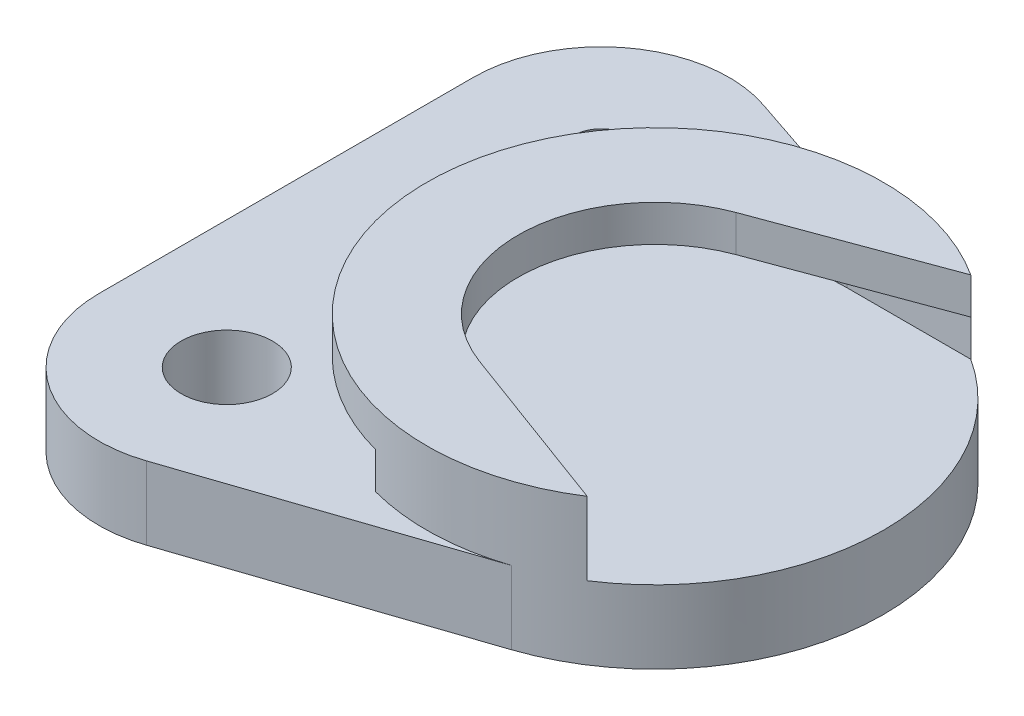
ISO-10303-21;
HEADER;
FILE_DESCRIPTION(('STEP AP214'),'2;1');
FILE_NAME('part.step','',(''),(''),'','','');
FILE_SCHEMA(('AUTOMOTIVE_DESIGN { 1 0 10303 214 1 1 1 1 }'));
ENDSEC;
DATA;
#1=APPLICATION_CONTEXT('core data for automotive mechanical design processes');
#2=APPLICATION_PROTOCOL_DEFINITION('international standard','automotive_design',2000,#1);
#3=PRODUCT_CONTEXT('',#1,'mechanical');
#4=PRODUCT('Part','Part','',(#3));
#5=PRODUCT_RELATED_PRODUCT_CATEGORY('part','',(#4));
#6=PRODUCT_DEFINITION_FORMATION('','',#4);
#7=PRODUCT_DEFINITION_CONTEXT('part definition',#1,'design');
#8=PRODUCT_DEFINITION('design','',#6,#7);
#9=PRODUCT_DEFINITION_SHAPE('','',#8);
#10=(LENGTH_UNIT() NAMED_UNIT(*) SI_UNIT(.MILLI.,.METRE.));
#11=(NAMED_UNIT(*) PLANE_ANGLE_UNIT() SI_UNIT($,.RADIAN.));
#12=(NAMED_UNIT(*) SI_UNIT($,.STERADIAN.) SOLID_ANGLE_UNIT());
#13=UNCERTAINTY_MEASURE_WITH_UNIT(LENGTH_MEASURE(1.E-05),#10,'distance_accuracy_value','');
#14=(GEOMETRIC_REPRESENTATION_CONTEXT(3) GLOBAL_UNCERTAINTY_ASSIGNED_CONTEXT((#13)) GLOBAL_UNIT_ASSIGNED_CONTEXT((#10,
#11,#12)) REPRESENTATION_CONTEXT('',''));
#15=CARTESIAN_POINT('',(0.,0.,0.));
#16=DIRECTION('',(0.,0.,1.));
#17=DIRECTION('',(1.,0.,0.));
#18=AXIS2_PLACEMENT_3D('',#15,#16,#17);
#19=CARTESIAN_POINT('',(0.,2.,0.));
#20=DIRECTION('',(0.,1.,0.));
#21=DIRECTION('',(0.,0.,1.));
#22=AXIS2_PLACEMENT_3D('',#19,#20,#21);
#23=PLANE('',#22);
#24=CARTESIAN_POINT('',(0.,2.,0.));
#25=DIRECTION('',(0.,-1.,0.));
#26=DIRECTION('',(0.,0.,-1.));
#27=AXIS2_PLACEMENT_3D('',#24,#25,#26);
#28=CIRCLE('',#27,12.5);
#29=CARTESIAN_POINT('',(3.99026691868763,2.,11.8460022757733));
#30=VERTEX_POINT('',#29);
#31=CARTESIAN_POINT('',(-3.23523806378148,2.,12.0740728286134));
#32=VERTEX_POINT('',#31);
#33=EDGE_CURVE('E57',#30,#32,#28,.T.);
#34=ORIENTED_EDGE('',*,*,#33,.T.);
#35=DIRECTION('',(-0.258819045102518,0.,0.965925826289069));
#36=VECTOR('',#35,1.);
#37=CARTESIAN_POINT('',(0.,2.,0.));
#38=LINE('',#37,#36);
#39=CARTESIAN_POINT('',(-2.71759997357644,2.,10.1422211760352));
#40=VERTEX_POINT('',#39);
#41=EDGE_CURVE('E371',#40,#32,#38,.T.);
#42=ORIENTED_EDGE('',*,*,#41,.F.);
#43=CARTESIAN_POINT('',(0.,2.,0.));
#44=DIRECTION('',(0.,1.,0.));
#45=DIRECTION('',(0.,0.,1.));
#46=AXIS2_PLACEMENT_3D('',#43,#44,#45);
#47=CIRCLE('',#46,10.5);
#48=CARTESIAN_POINT('',(0.,2.,10.5));
#49=VERTEX_POINT('',#48);
#50=EDGE_CURVE('E355',#40,#49,#47,.T.);
#51=ORIENTED_EDGE('',*,*,#50,.T.);
#52=DIRECTION('',(1.,0.,0.));
#53=VECTOR('',#52,1.);
#54=CARTESIAN_POINT('',(0.,2.,10.5));
#55=LINE('',#54,#53);
#56=CARTESIAN_POINT('',(6.78232998312527,2.,10.5));
#57=VERTEX_POINT('',#56);
#58=EDGE_CURVE('E361',#49,#57,#55,.T.);
#59=ORIENTED_EDGE('',*,*,#58,.T.);
#60=CARTESIAN_POINT('',(0.,2.,0.));
#61=DIRECTION('',(0.,1.,0.));
#62=DIRECTION('',(0.,0.,1.));
#63=AXIS2_PLACEMENT_3D('',#60,#61,#62);
#64=CIRCLE('',#63,12.5);
#65=CARTESIAN_POINT('',(6.78232998312527,2.,-10.5));
#66=VERTEX_POINT('',#65);
#67=EDGE_CURVE('E11',#57,#66,#64,.T.);
#68=ORIENTED_EDGE('',*,*,#67,.T.);
#69=DIRECTION('',(1.,0.,0.));
#70=VECTOR('',#69,1.);
#71=CARTESIAN_POINT('',(0.,2.,-10.5));
#72=LINE('',#71,#70);
#73=CARTESIAN_POINT('',(0.,2.,-10.5));
#74=VERTEX_POINT('',#73);
#75=EDGE_CURVE('E333',#74,#66,#72,.T.);
#76=ORIENTED_EDGE('',*,*,#75,.F.);
#77=CARTESIAN_POINT('',(0.,2.,0.));
#78=DIRECTION('',(0.,1.,0.));
#79=DIRECTION('',(0.,0.,1.));
#80=AXIS2_PLACEMENT_3D('',#77,#78,#79);
#81=CIRCLE('',#80,10.5);
#82=CARTESIAN_POINT('',(-2.71759997357644,2.,-10.1422211760352));
#83=VERTEX_POINT('',#82);
#84=EDGE_CURVE('E317',#74,#83,#81,.T.);
#85=ORIENTED_EDGE('',*,*,#84,.T.);
#86=DIRECTION('',(-0.258819045102518,0.,-0.965925826289069));
#87=VECTOR('',#86,1.);
#88=CARTESIAN_POINT('',(0.,2.,0.));
#89=LINE('',#88,#87);
#90=CARTESIAN_POINT('',(-3.23523806378147,2.,-12.0740728286134));
#91=VERTEX_POINT('',#90);
#92=EDGE_CURVE('E323',#83,#91,#89,.T.);
#93=ORIENTED_EDGE('',*,*,#92,.T.);
#94=CARTESIAN_POINT('',(3.99026691868763,2.,-11.8460022757733));
#95=VERTEX_POINT('',#94);
#96=EDGE_CURVE('E256',#91,#95,#28,.T.);
#97=ORIENTED_EDGE('',*,*,#96,.T.);
#98=DIRECTION('',(0.947680182061867,0.,0.319221353495011));
#99=VECTOR('',#98,1.);
#100=CARTESIAN_POINT('',(3.99026691868763,2.,-11.8460022757733));
#101=LINE('',#100,#99);
#102=CARTESIAN_POINT('',(-10.9654505255349,2.,-16.8837612744331));
#103=VERTEX_POINT('',#102);
#104=EDGE_CURVE('E247',#103,#95,#101,.T.);
#105=ORIENTED_EDGE('',*,*,#104,.F.);
#106=CARTESIAN_POINT('',(-13.2,2.,-10.25));
#107=DIRECTION('',(0.,-1.,0.));
#108=DIRECTION('',(0.,0.,-1.));
#109=AXIS2_PLACEMENT_3D('',#106,#107,#108);
#110=CIRCLE('',#109,7.);
#111=CARTESIAN_POINT('',(-20.2,2.,-10.25));
#112=VERTEX_POINT('',#111);
#113=EDGE_CURVE('E243',#112,#103,#110,.T.);
#114=ORIENTED_EDGE('',*,*,#113,.F.);
#115=DIRECTION('',(0.,0.,-1.));
#116=VECTOR('',#115,1.);
#117=CARTESIAN_POINT('',(-20.2,2.,10.25));
#118=LINE('',#117,#116);
#119=CARTESIAN_POINT('',(-20.2,2.,10.25));
#120=VERTEX_POINT('',#119);
#121=EDGE_CURVE('E239',#120,#112,#118,.T.);
#122=ORIENTED_EDGE('',*,*,#121,.F.);
#123=CARTESIAN_POINT('',(-13.2,2.,10.25));
#124=DIRECTION('',(0.,-1.,0.));
#125=DIRECTION('',(0.,0.,-1.));
#126=AXIS2_PLACEMENT_3D('',#123,#124,#125);
#127=CIRCLE('',#126,7.);
#128=CARTESIAN_POINT('',(-10.9654505255349,2.,16.8837612744331));
#129=VERTEX_POINT('',#128);
#130=EDGE_CURVE('E235',#129,#120,#127,.T.);
#131=ORIENTED_EDGE('',*,*,#130,.F.);
#132=DIRECTION('',(-0.947680182061867,0.,0.31922135349501));
#133=VECTOR('',#132,1.);
#134=CARTESIAN_POINT('',(-10.9654505255349,2.,16.8837612744331));
#135=LINE('',#134,#133);
#136=EDGE_CURVE('E251',#30,#129,#135,.T.);
#137=ORIENTED_EDGE('',*,*,#136,.F.);
#138=EDGE_LOOP('',(#34,#42,#51,#59,#68,#76,#85,#93,#97,#105,#114,#122,#131,#137));
#139=FACE_BOUND('',#138,.T.);
#140=DIRECTION('',(-0.906307787036649,0.,0.422618261740701));
#141=VECTOR('',#140,1.);
#142=CARTESIAN_POINT('',(0.,2.,0.));
#143=LINE('',#142,#141);
#144=CARTESIAN_POINT('',(-9.51623176388482,2.,4.43749174827736));
#145=VERTEX_POINT('',#144);
#146=CARTESIAN_POINT('',(-11.3288473379581,2.,5.28272827175876));
#147=VERTEX_POINT('',#146);
#148=EDGE_CURVE('E390',#145,#147,#143,.T.);
#149=ORIENTED_EDGE('',*,*,#148,.T.);
#150=CARTESIAN_POINT('',(-11.3288473379581,2.,-5.28272827175876));
#151=VERTEX_POINT('',#150);
#152=EDGE_CURVE('E270',#147,#151,#28,.T.);
#153=ORIENTED_EDGE('',*,*,#152,.T.);
#154=DIRECTION('',(-0.906307787036649,0.,-0.422618261740701));
#155=VECTOR('',#154,1.);
#156=CARTESIAN_POINT('',(0.,2.,0.));
#157=LINE('',#156,#155);
#158=CARTESIAN_POINT('',(-9.51623176388482,2.,-4.43749174827736));
#159=VERTEX_POINT('',#158);
#160=EDGE_CURVE('E395',#159,#151,#157,.T.);
#161=ORIENTED_EDGE('',*,*,#160,.F.);
#162=CARTESIAN_POINT('',(0.,2.,0.));
#163=DIRECTION('',(0.,1.,0.));
#164=DIRECTION('',(0.,0.,1.));
#165=AXIS2_PLACEMENT_3D('',#162,#163,#164);
#166=CIRCLE('',#165,10.5);
#167=EDGE_CURVE('E407',#159,#145,#166,.T.);
#168=ORIENTED_EDGE('',*,*,#167,.T.);
#169=EDGE_LOOP('',(#149,#153,#161,#168));
#170=FACE_BOUND('',#169,.T.);
#171=CARTESIAN_POINT('',(-13.2,2.,-10.25));
#172=DIRECTION('',(0.,-1.,0.));
#173=DIRECTION('',(0.,0.,-1.));
#174=AXIS2_PLACEMENT_3D('',#171,#172,#173);
#175=CIRCLE('',#174,1.5);
#176=CARTESIAN_POINT('',(-13.2,2.,-11.75));
#177=VERTEX_POINT('',#176);
#178=EDGE_CURVE('E227',#177,#177,#175,.T.);
#179=ORIENTED_EDGE('',*,*,#178,.T.);
#180=EDGE_LOOP('',(#179));
#181=FACE_BOUND('',#180,.T.);
#182=CARTESIAN_POINT('',(-13.2,2.,10.25));
#183=DIRECTION('',(0.,-1.,0.));
#184=DIRECTION('',(0.,0.,-1.));
#185=AXIS2_PLACEMENT_3D('',#182,#183,#184);
#186=CIRCLE('',#185,2.5);
#187=CARTESIAN_POINT('',(-13.2,2.,7.75));
#188=VERTEX_POINT('',#187);
#189=EDGE_CURVE('E231',#188,#188,#186,.T.);
#190=ORIENTED_EDGE('',*,*,#189,.T.);
#191=EDGE_LOOP('',(#190));
#192=FACE_BOUND('',#191,.T.);
#193=ADVANCED_FACE('F41',(#139,#170,#181,#192),#23,.T.);
#194=CARTESIAN_POINT('',(0.,2.,0.));
#195=DIRECTION('',(0.,-1.,0.));
#196=DIRECTION('',(0.,0.,-1.));
#197=AXIS2_PLACEMENT_3D('',#194,#195,#196);
#198=CYLINDRICAL_SURFACE('',#197,12.5);
#199=ORIENTED_EDGE('',*,*,#33,.F.);
#200=DIRECTION('',(0.,-1.,0.));
#201=VECTOR('',#200,1.);
#202=CARTESIAN_POINT('',(3.99026691868763,2.,11.8460022757733));
#203=LINE('',#202,#201);
#204=CARTESIAN_POINT('',(3.99026691868763,-2.,11.8460022757733));
#205=VERTEX_POINT('',#204);
#206=EDGE_CURVE('E181',#30,#205,#203,.T.);
#207=ORIENTED_EDGE('',*,*,#206,.T.);
#208=CARTESIAN_POINT('',(0.,-2.,0.));
#209=DIRECTION('',(0.,-1.,0.));
#210=DIRECTION('',(0.,0.,-1.));
#211=AXIS2_PLACEMENT_3D('',#208,#209,#210);
#212=CIRCLE('',#211,12.5);
#213=CARTESIAN_POINT('',(3.99026691868763,-2.,-11.8460022757733));
#214=VERTEX_POINT('',#213);
#215=EDGE_CURVE('E185',#214,#205,#212,.T.);
#216=ORIENTED_EDGE('',*,*,#215,.F.);
#217=DIRECTION('',(0.,-1.,0.));
#218=VECTOR('',#217,1.);
#219=CARTESIAN_POINT('',(3.99026691868763,2.,-11.8460022757733));
#220=LINE('',#219,#218);
#221=EDGE_CURVE('E64',#95,#214,#220,.T.);
#222=ORIENTED_EDGE('',*,*,#221,.F.);
#223=ORIENTED_EDGE('',*,*,#96,.F.);
#224=DIRECTION('',(0.,-1.,0.));
#225=VECTOR('',#224,1.);
#226=CARTESIAN_POINT('',(-3.23523806378147,4.,-12.0740728286134));
#227=LINE('',#226,#225);
#228=CARTESIAN_POINT('',(-3.23523806378147,4.,-12.0740728286134));
#229=VERTEX_POINT('',#228);
#230=EDGE_CURVE('E343',#229,#91,#227,.T.);
#231=ORIENTED_EDGE('',*,*,#230,.F.);
#232=CARTESIAN_POINT('',(0.,4.,0.));
#233=DIRECTION('',(0.,1.,0.));
#234=DIRECTION('',(0.,0.,1.));
#235=AXIS2_PLACEMENT_3D('',#232,#233,#234);
#236=CIRCLE('',#235,12.5);
#237=CARTESIAN_POINT('',(-11.3288473379581,4.,-5.28272827175876));
#238=VERTEX_POINT('',#237);
#239=EDGE_CURVE('E292',#229,#238,#236,.T.);
#240=ORIENTED_EDGE('',*,*,#239,.T.);
#241=DIRECTION('',(0.,-1.,0.));
#242=VECTOR('',#241,1.);
#243=CARTESIAN_POINT('',(-11.3288473379581,4.,-5.28272827175876));
#244=LINE('',#243,#242);
#245=EDGE_CURVE('E403',#238,#151,#244,.T.);
#246=ORIENTED_EDGE('',*,*,#245,.T.);
#247=ORIENTED_EDGE('',*,*,#152,.F.);
#248=DIRECTION('',(0.,-1.,0.));
#249=VECTOR('',#248,1.);
#250=CARTESIAN_POINT('',(-11.3288473379581,4.,5.28272827175876));
#251=LINE('',#250,#249);
#252=CARTESIAN_POINT('',(-11.3288473379581,4.,5.28272827175876));
#253=VERTEX_POINT('',#252);
#254=EDGE_CURVE('E50',#253,#147,#251,.T.);
#255=ORIENTED_EDGE('',*,*,#254,.F.);
#256=CARTESIAN_POINT('',(-3.23523806378148,4.,12.0740728286134));
#257=VERTEX_POINT('',#256);
#258=EDGE_CURVE('E288',#253,#257,#236,.T.);
#259=ORIENTED_EDGE('',*,*,#258,.T.);
#260=DIRECTION('',(0.,-1.,0.));
#261=VECTOR('',#260,1.);
#262=CARTESIAN_POINT('',(-3.23523806378148,4.,12.0740728286134));
#263=LINE('',#262,#261);
#264=EDGE_CURVE('E383',#257,#32,#263,.T.);
#265=ORIENTED_EDGE('',*,*,#264,.T.);
#266=EDGE_LOOP('',(#199,#207,#216,#222,#223,#231,#240,#246,#247,#255,#259,#265));
#267=FACE_BOUND('',#266,.T.);
#268=ORIENTED_EDGE('',*,*,#67,.F.);
#269=DIRECTION('',(0.,-1.,0.));
#270=VECTOR('',#269,1.);
#271=CARTESIAN_POINT('',(6.78232998312527,4.,10.5));
#272=LINE('',#271,#270);
#273=CARTESIAN_POINT('',(6.78232998312527,4.,10.5));
#274=VERTEX_POINT('',#273);
#275=EDGE_CURVE('E379',#274,#57,#272,.T.);
#276=ORIENTED_EDGE('',*,*,#275,.F.);
#277=DIRECTION('',(0.,-1.,0.));
#278=VECTOR('',#277,1.);
#279=CARTESIAN_POINT('',(6.78232998312527,6.,10.5));
#280=LINE('',#279,#278);
#281=CARTESIAN_POINT('',(6.78232998312527,6.,10.5));
#282=VERTEX_POINT('',#281);
#283=EDGE_CURVE('E313',#282,#274,#280,.T.);
#284=ORIENTED_EDGE('',*,*,#283,.F.);
#285=CARTESIAN_POINT('',(0.,6.,0.));
#286=DIRECTION('',(0.,1.,0.));
#287=DIRECTION('',(0.,0.,1.));
#288=AXIS2_PLACEMENT_3D('',#285,#286,#287);
#289=CIRCLE('',#288,12.5);
#290=CARTESIAN_POINT('',(6.78232998312527,6.,-10.5));
#291=VERTEX_POINT('',#290);
#292=EDGE_CURVE('E271',#291,#282,#289,.T.);
#293=ORIENTED_EDGE('',*,*,#292,.F.);
#294=DIRECTION('',(0.,-1.,0.));
#295=VECTOR('',#294,1.);
#296=CARTESIAN_POINT('',(6.78232998312527,6.,-10.5));
#297=LINE('',#296,#295);
#298=CARTESIAN_POINT('',(6.78232998312527,4.,-10.5));
#299=VERTEX_POINT('',#298);
#300=EDGE_CURVE('E287',#291,#299,#297,.T.);
#301=ORIENTED_EDGE('',*,*,#300,.T.);
#302=DIRECTION('',(0.,-1.,0.));
#303=VECTOR('',#302,1.);
#304=CARTESIAN_POINT('',(6.78232998312527,4.,-10.5));
#305=LINE('',#304,#303);
#306=EDGE_CURVE('E347',#299,#66,#305,.T.);
#307=ORIENTED_EDGE('',*,*,#306,.T.);
#308=EDGE_LOOP('',(#268,#276,#284,#293,#301,#307));
#309=FACE_BOUND('',#308,.T.);
#310=ADVANCED_FACE('F43',(#267,#309),#198,.T.);
#311=CARTESIAN_POINT('',(0.,4.,0.));
#312=DIRECTION('',(0.422618261740701,0.,0.906307787036649));
#313=DIRECTION('',(0.906307787036649,0.,-0.422618261740701));
#314=AXIS2_PLACEMENT_3D('',#311,#312,#313);
#315=PLANE('',#314);
#316=ORIENTED_EDGE('',*,*,#148,.F.);
#317=DIRECTION('',(0.,-1.,0.));
#318=VECTOR('',#317,1.);
#319=CARTESIAN_POINT('',(-9.51623176388482,4.,4.43749174827736));
#320=LINE('',#319,#318);
#321=CARTESIAN_POINT('',(-9.51623176388482,4.,4.43749174827736));
#322=VERTEX_POINT('',#321);
#323=EDGE_CURVE('E419',#322,#145,#320,.T.);
#324=ORIENTED_EDGE('',*,*,#323,.F.);
#325=DIRECTION('',(-0.906307787036649,0.,0.422618261740701));
#326=VECTOR('',#325,1.);
#327=CARTESIAN_POINT('',(0.,4.,0.));
#328=LINE('',#327,#326);
#329=EDGE_CURVE('E391',#322,#253,#328,.T.);
#330=ORIENTED_EDGE('',*,*,#329,.T.);
#331=ORIENTED_EDGE('',*,*,#254,.T.);
#332=EDGE_LOOP('',(#316,#324,#330,#331));
#333=FACE_BOUND('',#332,.T.);
#334=ADVANCED_FACE('F426',(#333),#315,.T.);
#335=CARTESIAN_POINT('',(0.,4.,0.));
#336=DIRECTION('',(0.,-1.,0.));
#337=DIRECTION('',(0.,0.,-1.));
#338=AXIS2_PLACEMENT_3D('',#335,#336,#337);
#339=CYLINDRICAL_SURFACE('',#338,10.5);
#340=ORIENTED_EDGE('',*,*,#167,.F.);
#341=DIRECTION('',(0.,-1.,0.));
#342=VECTOR('',#341,1.);
#343=CARTESIAN_POINT('',(-9.51623176388482,4.,-4.43749174827736));
#344=LINE('',#343,#342);
#345=CARTESIAN_POINT('',(-9.51623176388482,4.,-4.43749174827736));
#346=VERTEX_POINT('',#345);
#347=EDGE_CURVE('E416',#346,#159,#344,.T.);
#348=ORIENTED_EDGE('',*,*,#347,.F.);
#349=CARTESIAN_POINT('',(0.,4.,0.));
#350=DIRECTION('',(0.,1.,0.));
#351=DIRECTION('',(0.,0.,1.));
#352=AXIS2_PLACEMENT_3D('',#349,#350,#351);
#353=CIRCLE('',#352,10.5);
#354=EDGE_CURVE('E394',#346,#322,#353,.T.);
#355=ORIENTED_EDGE('',*,*,#354,.T.);
#356=ORIENTED_EDGE('',*,*,#323,.T.);
#357=EDGE_LOOP('',(#340,#348,#355,#356));
#358=FACE_BOUND('',#357,.T.);
#359=ADVANCED_FACE('F435',(#358),#339,.F.);
#360=CARTESIAN_POINT('',(0.,4.,0.));
#361=DIRECTION('',(-0.422618261740701,0.,0.906307787036649));
#362=DIRECTION('',(0.906307787036649,0.,0.422618261740701));
#363=AXIS2_PLACEMENT_3D('',#360,#361,#362);
#364=PLANE('',#363);
#365=ORIENTED_EDGE('',*,*,#160,.T.);
#366=ORIENTED_EDGE('',*,*,#245,.F.);
#367=DIRECTION('',(-0.906307787036649,0.,-0.422618261740701));
#368=VECTOR('',#367,1.);
#369=CARTESIAN_POINT('',(0.,4.,0.));
#370=LINE('',#369,#368);
#371=EDGE_CURVE('E399',#346,#238,#370,.T.);
#372=ORIENTED_EDGE('',*,*,#371,.F.);
#373=ORIENTED_EDGE('',*,*,#347,.T.);
#374=EDGE_LOOP('',(#365,#366,#372,#373));
#375=FACE_BOUND('',#374,.T.);
#376=ADVANCED_FACE('F454',(#375),#364,.F.);
#377=CARTESIAN_POINT('',(0.,4.,0.));
#378=DIRECTION('',(0.,-1.,0.));
#379=DIRECTION('',(0.,0.,-1.));
#380=AXIS2_PLACEMENT_3D('',#377,#378,#379);
#381=CYLINDRICAL_SURFACE('',#380,10.5);
#382=ORIENTED_EDGE('',*,*,#50,.F.);
#383=DIRECTION('',(0.,-1.,0.));
#384=VECTOR('',#383,1.);
#385=CARTESIAN_POINT('',(-2.71759997357644,4.,10.1422211760352));
#386=LINE('',#385,#384);
#387=CARTESIAN_POINT('',(-2.71759997357644,4.,10.1422211760352));
#388=VERTEX_POINT('',#387);
#389=EDGE_CURVE('E386',#388,#40,#386,.T.);
#390=ORIENTED_EDGE('',*,*,#389,.F.);
#391=CARTESIAN_POINT('',(0.,4.,0.));
#392=DIRECTION('',(0.,1.,0.));
#393=DIRECTION('',(0.,0.,1.));
#394=AXIS2_PLACEMENT_3D('',#391,#392,#393);
#395=CIRCLE('',#394,10.5);
#396=CARTESIAN_POINT('',(0.,4.,10.5));
#397=VERTEX_POINT('',#396);
#398=EDGE_CURVE('E356',#388,#397,#395,.T.);
#399=ORIENTED_EDGE('',*,*,#398,.T.);
#400=DIRECTION('',(0.,-1.,0.));
#401=VECTOR('',#400,1.);
#402=CARTESIAN_POINT('',(0.,4.,10.5));
#403=LINE('',#402,#401);
#404=EDGE_CURVE('E368',#397,#49,#403,.T.);
#405=ORIENTED_EDGE('',*,*,#404,.T.);
#406=EDGE_LOOP('',(#382,#390,#399,#405));
#407=FACE_BOUND('',#406,.T.);
#408=ADVANCED_FACE('F456',(#407),#381,.F.);
#409=CARTESIAN_POINT('',(0.,4.,0.));
#410=DIRECTION('',(0.965925826289069,0.,0.258819045102518));
#411=DIRECTION('',(0.258819045102518,0.,-0.965925826289069));
#412=AXIS2_PLACEMENT_3D('',#409,#410,#411);
#413=PLANE('',#412);
#414=ORIENTED_EDGE('',*,*,#41,.T.);
#415=ORIENTED_EDGE('',*,*,#264,.F.);
#416=DIRECTION('',(-0.258819045102518,0.,0.965925826289069));
#417=VECTOR('',#416,1.);
#418=CARTESIAN_POINT('',(0.,4.,0.));
#419=LINE('',#418,#417);
#420=EDGE_CURVE('E360',#388,#257,#419,.T.);
#421=ORIENTED_EDGE('',*,*,#420,.F.);
#422=ORIENTED_EDGE('',*,*,#389,.T.);
#423=EDGE_LOOP('',(#414,#415,#421,#422));
#424=FACE_BOUND('',#423,.T.);
#425=ADVANCED_FACE('F462',(#424),#413,.F.);
#426=CARTESIAN_POINT('',(0.,4.,10.5));
#427=DIRECTION('',(0.,0.,-1.));
#428=DIRECTION('',(-1.,0.,0.));
#429=AXIS2_PLACEMENT_3D('',#426,#427,#428);
#430=PLANE('',#429);
#431=ORIENTED_EDGE('',*,*,#58,.F.);
#432=ORIENTED_EDGE('',*,*,#404,.F.);
#433=DIRECTION('',(1.,0.,0.));
#434=VECTOR('',#433,1.);
#435=CARTESIAN_POINT('',(0.,4.,10.5));
#436=LINE('',#435,#434);
#437=EDGE_CURVE('E365',#397,#274,#436,.T.);
#438=ORIENTED_EDGE('',*,*,#437,.T.);
#439=ORIENTED_EDGE('',*,*,#275,.T.);
#440=EDGE_LOOP('',(#431,#432,#438,#439));
#441=FACE_BOUND('',#440,.T.);
#442=ADVANCED_FACE('F592',(#441),#430,.T.);
#443=CARTESIAN_POINT('',(0.,4.,0.));
#444=DIRECTION('',(0.,-1.,0.));
#445=DIRECTION('',(0.,0.,-1.));
#446=AXIS2_PLACEMENT_3D('',#443,#444,#445);
#447=CYLINDRICAL_SURFACE('',#446,10.5);
#448=ORIENTED_EDGE('',*,*,#84,.F.);
#449=DIRECTION('',(0.,-1.,0.));
#450=VECTOR('',#449,1.);
#451=CARTESIAN_POINT('',(0.,4.,-10.5));
#452=LINE('',#451,#450);
#453=CARTESIAN_POINT('',(0.,4.,-10.5));
#454=VERTEX_POINT('',#453);
#455=EDGE_CURVE('E351',#454,#74,#452,.T.);
#456=ORIENTED_EDGE('',*,*,#455,.F.);
#457=CARTESIAN_POINT('',(0.,4.,0.));
#458=DIRECTION('',(0.,1.,0.));
#459=DIRECTION('',(0.,0.,1.));
#460=AXIS2_PLACEMENT_3D('',#457,#458,#459);
#461=CIRCLE('',#460,10.5);
#462=CARTESIAN_POINT('',(-2.71759997357644,4.,-10.1422211760352));
#463=VERTEX_POINT('',#462);
#464=EDGE_CURVE('E318',#454,#463,#461,.T.);
#465=ORIENTED_EDGE('',*,*,#464,.T.);
#466=DIRECTION('',(0.,-1.,0.));
#467=VECTOR('',#466,1.);
#468=CARTESIAN_POINT('',(-2.71759997357644,4.,-10.1422211760352));
#469=LINE('',#468,#467);
#470=EDGE_CURVE('E330',#463,#83,#469,.T.);
#471=ORIENTED_EDGE('',*,*,#470,.T.);
#472=EDGE_LOOP('',(#448,#456,#465,#471));
#473=FACE_BOUND('',#472,.T.);
#474=ADVANCED_FACE('F588',(#473),#447,.F.);
#475=CARTESIAN_POINT('',(0.,4.,-10.5));
#476=DIRECTION('',(0.,0.,-1.));
#477=DIRECTION('',(-1.,0.,0.));
#478=AXIS2_PLACEMENT_3D('',#475,#476,#477);
#479=PLANE('',#478);
#480=ORIENTED_EDGE('',*,*,#75,.T.);
#481=ORIENTED_EDGE('',*,*,#306,.F.);
#482=DIRECTION('',(1.,0.,0.));
#483=VECTOR('',#482,1.);
#484=CARTESIAN_POINT('',(0.,4.,-10.5));
#485=LINE('',#484,#483);
#486=EDGE_CURVE('E322',#454,#299,#485,.T.);
#487=ORIENTED_EDGE('',*,*,#486,.F.);
#488=ORIENTED_EDGE('',*,*,#455,.T.);
#489=EDGE_LOOP('',(#480,#481,#487,#488));
#490=FACE_BOUND('',#489,.T.);
#491=ADVANCED_FACE('F584',(#490),#479,.F.);
#492=CARTESIAN_POINT('',(0.,4.,0.));
#493=DIRECTION('',(-0.965925826289069,0.,0.258819045102518));
#494=DIRECTION('',(0.258819045102518,0.,0.965925826289069));
#495=AXIS2_PLACEMENT_3D('',#492,#493,#494);
#496=PLANE('',#495);
#497=ORIENTED_EDGE('',*,*,#92,.F.);
#498=ORIENTED_EDGE('',*,*,#470,.F.);
#499=DIRECTION('',(-0.258819045102518,0.,-0.965925826289069));
#500=VECTOR('',#499,1.);
#501=CARTESIAN_POINT('',(0.,4.,0.));
#502=LINE('',#501,#500);
#503=EDGE_CURVE('E327',#463,#229,#502,.T.);
#504=ORIENTED_EDGE('',*,*,#503,.T.);
#505=ORIENTED_EDGE('',*,*,#230,.T.);
#506=EDGE_LOOP('',(#497,#498,#504,#505));
#507=FACE_BOUND('',#506,.T.);
#508=ADVANCED_FACE('F571',(#507),#496,.T.);
#509=CARTESIAN_POINT('',(0.,4.,0.));
#510=DIRECTION('',(0.,1.,0.));
#511=DIRECTION('',(0.,0.,1.));
#512=AXIS2_PLACEMENT_3D('',#509,#510,#511);
#513=PLANE('',#512);
#514=ORIENTED_EDGE('',*,*,#329,.F.);
#515=ORIENTED_EDGE('',*,*,#354,.F.);
#516=ORIENTED_EDGE('',*,*,#371,.T.);
#517=ORIENTED_EDGE('',*,*,#239,.F.);
#518=ORIENTED_EDGE('',*,*,#503,.F.);
#519=ORIENTED_EDGE('',*,*,#464,.F.);
#520=ORIENTED_EDGE('',*,*,#486,.T.);
#521=DIRECTION('',(-0.938069118920017,0.,0.346448160809987));
#522=VECTOR('',#521,1.);
#523=CARTESIAN_POINT('',(-2.5983612060749,4.,-7.03551839190013));
#524=LINE('',#523,#522);
#525=CARTESIAN_POINT('',(-2.5983612060749,4.,-7.03551839190013));
#526=VERTEX_POINT('',#525);
#527=EDGE_CURVE('E276',#299,#526,#524,.T.);
#528=ORIENTED_EDGE('',*,*,#527,.T.);
#529=CARTESIAN_POINT('',(0.,4.,0.));
#530=DIRECTION('',(0.,1.,0.));
#531=DIRECTION('',(0.,0.,1.));
#532=AXIS2_PLACEMENT_3D('',#529,#530,#531);
#533=CIRCLE('',#532,7.5);
#534=CARTESIAN_POINT('',(-2.5983612060749,4.,7.03551839190013));
#535=VERTEX_POINT('',#534);
#536=EDGE_CURVE('E297',#526,#535,#533,.T.);
#537=ORIENTED_EDGE('',*,*,#536,.T.);
#538=DIRECTION('',(-0.938069118920017,0.,-0.346448160809987));
#539=VECTOR('',#538,1.);
#540=CARTESIAN_POINT('',(-2.5983612060749,4.,7.03551839190013));
#541=LINE('',#540,#539);
#542=EDGE_CURVE('E293',#274,#535,#541,.T.);
#543=ORIENTED_EDGE('',*,*,#542,.F.);
#544=ORIENTED_EDGE('',*,*,#437,.F.);
#545=ORIENTED_EDGE('',*,*,#398,.F.);
#546=ORIENTED_EDGE('',*,*,#420,.T.);
#547=ORIENTED_EDGE('',*,*,#258,.F.);
#548=EDGE_LOOP('',(#514,#515,#516,#517,#518,#519,#520,#528,#537,#543,#544,#545,#546,#547));
#549=FACE_BOUND('',#548,.T.);
#550=ADVANCED_FACE('F439',(#549),#513,.F.);
#551=CARTESIAN_POINT('',(-2.5983612060749,6.,7.03551839190013));
#552=DIRECTION('',(-0.346448160809987,0.,0.938069118920017));
#553=DIRECTION('',(0.938069118920017,0.,0.346448160809987));
#554=AXIS2_PLACEMENT_3D('',#551,#552,#553);
#555=PLANE('',#554);
#556=ORIENTED_EDGE('',*,*,#542,.T.);
#557=DIRECTION('',(0.,-1.,0.));
#558=VECTOR('',#557,1.);
#559=CARTESIAN_POINT('',(-2.5983612060749,6.,7.03551839190013));
#560=LINE('',#559,#558);
#561=CARTESIAN_POINT('',(-2.5983612060749,6.,7.03551839190013));
#562=VERTEX_POINT('',#561);
#563=EDGE_CURVE('E310',#562,#535,#560,.T.);
#564=ORIENTED_EDGE('',*,*,#563,.F.);
#565=DIRECTION('',(-0.938069118920017,0.,-0.346448160809987));
#566=VECTOR('',#565,1.);
#567=CARTESIAN_POINT('',(-2.5983612060749,6.,7.03551839190013));
#568=LINE('',#567,#566);
#569=EDGE_CURVE('E275',#282,#562,#568,.T.);
#570=ORIENTED_EDGE('',*,*,#569,.F.);
#571=ORIENTED_EDGE('',*,*,#283,.T.);
#572=EDGE_LOOP('',(#556,#564,#570,#571));
#573=FACE_BOUND('',#572,.T.);
#574=ADVANCED_FACE('F570',(#573),#555,.F.);
#575=CARTESIAN_POINT('',(0.,6.,0.));
#576=DIRECTION('',(0.,-1.,0.));
#577=DIRECTION('',(0.,0.,-1.));
#578=AXIS2_PLACEMENT_3D('',#575,#576,#577);
#579=CYLINDRICAL_SURFACE('',#578,7.5);
#580=ORIENTED_EDGE('',*,*,#536,.F.);
#581=DIRECTION('',(0.,-1.,0.));
#582=VECTOR('',#581,1.);
#583=CARTESIAN_POINT('',(-2.5983612060749,6.,-7.03551839190013));
#584=LINE('',#583,#582);
#585=CARTESIAN_POINT('',(-2.5983612060749,6.,-7.03551839190013));
#586=VERTEX_POINT('',#585);
#587=EDGE_CURVE('E307',#586,#526,#584,.T.);
#588=ORIENTED_EDGE('',*,*,#587,.F.);
#589=CARTESIAN_POINT('',(0.,6.,0.));
#590=DIRECTION('',(0.,1.,0.));
#591=DIRECTION('',(0.,0.,1.));
#592=AXIS2_PLACEMENT_3D('',#589,#590,#591);
#593=CIRCLE('',#592,7.5);
#594=EDGE_CURVE('E279',#586,#562,#593,.T.);
#595=ORIENTED_EDGE('',*,*,#594,.T.);
#596=ORIENTED_EDGE('',*,*,#563,.T.);
#597=EDGE_LOOP('',(#580,#588,#595,#596));
#598=FACE_BOUND('',#597,.T.);
#599=ADVANCED_FACE('F574',(#598),#579,.F.);
#600=CARTESIAN_POINT('',(-2.5983612060749,6.,-7.03551839190013));
#601=DIRECTION('',(0.346448160809987,0.,0.938069118920017));
#602=DIRECTION('',(0.938069118920017,0.,-0.346448160809987));
#603=AXIS2_PLACEMENT_3D('',#600,#601,#602);
#604=PLANE('',#603);
#605=ORIENTED_EDGE('',*,*,#527,.F.);
#606=ORIENTED_EDGE('',*,*,#300,.F.);
#607=DIRECTION('',(-0.938069118920017,0.,0.346448160809987));
#608=VECTOR('',#607,1.);
#609=CARTESIAN_POINT('',(-2.5983612060749,6.,-7.03551839190013));
#610=LINE('',#609,#608);
#611=EDGE_CURVE('E283',#291,#586,#610,.T.);
#612=ORIENTED_EDGE('',*,*,#611,.T.);
#613=ORIENTED_EDGE('',*,*,#587,.T.);
#614=EDGE_LOOP('',(#605,#606,#612,#613));
#615=FACE_BOUND('',#614,.T.);
#616=ADVANCED_FACE('F566',(#615),#604,.T.);
#617=CARTESIAN_POINT('',(0.,6.,0.));
#618=DIRECTION('',(0.,1.,0.));
#619=DIRECTION('',(0.,0.,1.));
#620=AXIS2_PLACEMENT_3D('',#617,#618,#619);
#621=PLANE('',#620);
#622=ORIENTED_EDGE('',*,*,#292,.T.);
#623=ORIENTED_EDGE('',*,*,#569,.T.);
#624=ORIENTED_EDGE('',*,*,#594,.F.);
#625=ORIENTED_EDGE('',*,*,#611,.F.);
#626=EDGE_LOOP('',(#622,#623,#624,#625));
#627=FACE_BOUND('',#626,.T.);
#628=ADVANCED_FACE('F562',(#627),#621,.T.);
#629=CARTESIAN_POINT('',(-13.2,2.,10.25));
#630=DIRECTION('',(0.,-1.,0.));
#631=DIRECTION('',(0.,0.,-1.));
#632=AXIS2_PLACEMENT_3D('',#629,#630,#631);
#633=CYLINDRICAL_SURFACE('',#632,7.);
#634=DIRECTION('',(0.,-1.,0.));
#635=VECTOR('',#634,1.);
#636=CARTESIAN_POINT('',(-20.2,2.,10.25));
#637=LINE('',#636,#635);
#638=CARTESIAN_POINT('',(-20.2,-2.,10.25));
#639=VERTEX_POINT('',#638);
#640=EDGE_CURVE('E254',#120,#639,#637,.T.);
#641=ORIENTED_EDGE('',*,*,#640,.T.);
#642=CARTESIAN_POINT('',(-13.2,-2.,10.25));
#643=DIRECTION('',(0.,-1.,0.));
#644=DIRECTION('',(0.,0.,-1.));
#645=AXIS2_PLACEMENT_3D('',#642,#643,#644);
#646=CIRCLE('',#645,7.);
#647=CARTESIAN_POINT('',(-10.9654505255349,-2.,16.8837612744331));
#648=VERTEX_POINT('',#647);
#649=EDGE_CURVE('E199',#648,#639,#646,.T.);
#650=ORIENTED_EDGE('',*,*,#649,.F.);
#651=DIRECTION('',(0.,-1.,0.));
#652=VECTOR('',#651,1.);
#653=CARTESIAN_POINT('',(-10.9654505255349,2.,16.8837612744331));
#654=LINE('',#653,#652);
#655=EDGE_CURVE('E190',#129,#648,#654,.T.);
#656=ORIENTED_EDGE('',*,*,#655,.F.);
#657=ORIENTED_EDGE('',*,*,#130,.T.);
#658=EDGE_LOOP('',(#641,#650,#656,#657));
#659=FACE_BOUND('',#658,.T.);
#660=ADVANCED_FACE('F549',(#659),#633,.T.);
#661=CARTESIAN_POINT('',(-10.9654505255349,2.,16.8837612744331));
#662=DIRECTION('',(0.31922135349501,0.,0.947680182061867));
#663=DIRECTION('',(0.947680182061867,0.,-0.31922135349501));
#664=AXIS2_PLACEMENT_3D('',#661,#662,#663);
#665=PLANE('',#664);
#666=ORIENTED_EDGE('',*,*,#655,.T.);
#667=DIRECTION('',(-0.947680182061867,0.,0.319221353495011));
#668=VECTOR('',#667,1.);
#669=CARTESIAN_POINT('',(3.99026691868763,-2.,11.8460022757733));
#670=LINE('',#669,#668);
#671=EDGE_CURVE('E193',#205,#648,#670,.T.);
#672=ORIENTED_EDGE('',*,*,#671,.F.);
#673=ORIENTED_EDGE('',*,*,#206,.F.);
#674=ORIENTED_EDGE('',*,*,#136,.T.);
#675=EDGE_LOOP('',(#666,#672,#673,#674));
#676=FACE_BOUND('',#675,.T.);
#677=ADVANCED_FACE('F194',(#676),#665,.T.);
#678=CARTESIAN_POINT('',(3.99026691868763,2.,-11.8460022757733));
#679=DIRECTION('',(0.319221353495011,0.,-0.947680182061867));
#680=DIRECTION('',(-0.947680182061867,0.,-0.319221353495011));
#681=AXIS2_PLACEMENT_3D('',#678,#679,#680);
#682=PLANE('',#681);
#683=ORIENTED_EDGE('',*,*,#221,.T.);
#684=DIRECTION('',(0.947680182061867,0.,0.319221353495011));
#685=VECTOR('',#684,1.);
#686=CARTESIAN_POINT('',(-10.9654505255349,-2.,-16.8837612744331));
#687=LINE('',#686,#685);
#688=CARTESIAN_POINT('',(-10.9654505255349,-2.,-16.8837612744331));
#689=VERTEX_POINT('',#688);
#690=EDGE_CURVE('E206',#689,#214,#687,.T.);
#691=ORIENTED_EDGE('',*,*,#690,.F.);
#692=DIRECTION('',(0.,-1.,0.));
#693=VECTOR('',#692,1.);
#694=CARTESIAN_POINT('',(-10.9654505255349,2.,-16.8837612744331));
#695=LINE('',#694,#693);
#696=EDGE_CURVE('E260',#103,#689,#695,.T.);
#697=ORIENTED_EDGE('',*,*,#696,.F.);
#698=ORIENTED_EDGE('',*,*,#104,.T.);
#699=EDGE_LOOP('',(#683,#691,#697,#698));
#700=FACE_BOUND('',#699,.T.);
#701=ADVANCED_FACE('F548',(#700),#682,.T.);
#702=CARTESIAN_POINT('',(-13.2,2.,-10.25));
#703=DIRECTION('',(0.,-1.,0.));
#704=DIRECTION('',(0.,0.,-1.));
#705=AXIS2_PLACEMENT_3D('',#702,#703,#704);
#706=CYLINDRICAL_SURFACE('',#705,7.);
#707=ORIENTED_EDGE('',*,*,#696,.T.);
#708=CARTESIAN_POINT('',(-13.2,-2.,-10.25));
#709=DIRECTION('',(0.,-1.,0.));
#710=DIRECTION('',(0.,0.,-1.));
#711=AXIS2_PLACEMENT_3D('',#708,#709,#710);
#712=CIRCLE('',#711,7.);
#713=CARTESIAN_POINT('',(-20.2,-2.,-10.25));
#714=VERTEX_POINT('',#713);
#715=EDGE_CURVE('E222',#714,#689,#712,.T.);
#716=ORIENTED_EDGE('',*,*,#715,.F.);
#717=DIRECTION('',(0.,-1.,0.));
#718=VECTOR('',#717,1.);
#719=CARTESIAN_POINT('',(-20.2,2.,-10.25));
#720=LINE('',#719,#718);
#721=EDGE_CURVE('E263',#112,#714,#720,.T.);
#722=ORIENTED_EDGE('',*,*,#721,.F.);
#723=ORIENTED_EDGE('',*,*,#113,.T.);
#724=EDGE_LOOP('',(#707,#716,#722,#723));
#725=FACE_BOUND('',#724,.T.);
#726=ADVANCED_FACE('F552',(#725),#706,.T.);
#727=CARTESIAN_POINT('',(-20.2,2.,10.25));
#728=DIRECTION('',(-1.,0.,0.));
#729=DIRECTION('',(0.,0.,1.));
#730=AXIS2_PLACEMENT_3D('',#727,#728,#729);
#731=PLANE('',#730);
#732=ORIENTED_EDGE('',*,*,#721,.T.);
#733=DIRECTION('',(0.,0.,-1.));
#734=VECTOR('',#733,1.);
#735=CARTESIAN_POINT('',(-20.2,-2.,10.25));
#736=LINE('',#735,#734);
#737=EDGE_CURVE('E218',#639,#714,#736,.T.);
#738=ORIENTED_EDGE('',*,*,#737,.F.);
#739=ORIENTED_EDGE('',*,*,#640,.F.);
#740=ORIENTED_EDGE('',*,*,#121,.T.);
#741=EDGE_LOOP('',(#732,#738,#739,#740));
#742=FACE_BOUND('',#741,.T.);
#743=ADVANCED_FACE('F544',(#742),#731,.T.);
#744=CARTESIAN_POINT('',(-13.2,2.,10.25));
#745=DIRECTION('',(0.,-1.,0.));
#746=DIRECTION('',(0.,0.,-1.));
#747=AXIS2_PLACEMENT_3D('',#744,#745,#746);
#748=CYLINDRICAL_SURFACE('',#747,2.5);
#749=ORIENTED_EDGE('',*,*,#189,.F.);
#750=EDGE_LOOP('',(#749));
#751=FACE_BOUND('',#750,.T.);
#752=CARTESIAN_POINT('',(-13.2,-2.,10.25));
#753=DIRECTION('',(0.,-1.,0.));
#754=DIRECTION('',(0.,0.,-1.));
#755=AXIS2_PLACEMENT_3D('',#752,#753,#754);
#756=CIRCLE('',#755,2.5);
#757=CARTESIAN_POINT('',(-13.2,-2.,7.75));
#758=VERTEX_POINT('',#757);
#759=EDGE_CURVE('E514',#758,#758,#756,.T.);
#760=ORIENTED_EDGE('',*,*,#759,.T.);
#761=EDGE_LOOP('',(#760));
#762=FACE_BOUND('',#761,.T.);
#763=ADVANCED_FACE('F522',(#751,#762),#748,.F.);
#764=CARTESIAN_POINT('',(-13.2,2.,-10.25));
#765=DIRECTION('',(0.,-1.,0.));
#766=DIRECTION('',(0.,0.,-1.));
#767=AXIS2_PLACEMENT_3D('',#764,#765,#766);
#768=CYLINDRICAL_SURFACE('',#767,1.5);
#769=ORIENTED_EDGE('',*,*,#178,.F.);
#770=EDGE_LOOP('',(#769));
#771=FACE_BOUND('',#770,.T.);
#772=CARTESIAN_POINT('',(-13.2,-2.,-10.25));
#773=DIRECTION('',(0.,-1.,0.));
#774=DIRECTION('',(0.,0.,-1.));
#775=AXIS2_PLACEMENT_3D('',#772,#773,#774);
#776=CIRCLE('',#775,1.5);
#777=CARTESIAN_POINT('',(-13.2,-2.,-11.75));
#778=VERTEX_POINT('',#777);
#779=EDGE_CURVE('E208',#778,#778,#776,.T.);
#780=ORIENTED_EDGE('',*,*,#779,.T.);
#781=EDGE_LOOP('',(#780));
#782=FACE_BOUND('',#781,.T.);
#783=ADVANCED_FACE('F526',(#771,#782),#768,.F.);
#784=CARTESIAN_POINT('',(0.,-2.,0.));
#785=DIRECTION('',(0.,-1.,0.));
#786=DIRECTION('',(0.,0.,-1.));
#787=AXIS2_PLACEMENT_3D('',#784,#785,#786);
#788=PLANE('',#787);
#789=CARTESIAN_POINT('',(-13.2,-2.,15.25));
#790=DIRECTION('',(0.,-1.,0.));
#791=DIRECTION('',(0.,0.,-1.));
#792=AXIS2_PLACEMENT_3D('',#789,#790,#791);
#793=CIRCLE('',#792,1.);
#794=CARTESIAN_POINT('',(-13.2,-2.,14.25));
#795=VERTEX_POINT('',#794);
#796=EDGE_CURVE('E506',#795,#795,#793,.T.);
#797=ORIENTED_EDGE('',*,*,#796,.F.);
#798=EDGE_LOOP('',(#797));
#799=FACE_BOUND('',#798,.T.);
#800=CARTESIAN_POINT('',(-13.2,-2.,5.25));
#801=DIRECTION('',(0.,-1.,0.));
#802=DIRECTION('',(0.,0.,-1.));
#803=AXIS2_PLACEMENT_3D('',#800,#801,#802);
#804=CIRCLE('',#803,1.);
#805=CARTESIAN_POINT('',(-13.2,-2.,4.25));
#806=VERTEX_POINT('',#805);
#807=EDGE_CURVE('E489',#806,#806,#804,.T.);
#808=ORIENTED_EDGE('',*,*,#807,.F.);
#809=EDGE_LOOP('',(#808));
#810=FACE_BOUND('',#809,.T.);
#811=ORIENTED_EDGE('',*,*,#779,.F.);
#812=EDGE_LOOP('',(#811));
#813=FACE_BOUND('',#812,.T.);
#814=ORIENTED_EDGE('',*,*,#215,.T.);
#815=ORIENTED_EDGE('',*,*,#671,.T.);
#816=ORIENTED_EDGE('',*,*,#649,.T.);
#817=ORIENTED_EDGE('',*,*,#737,.T.);
#818=ORIENTED_EDGE('',*,*,#715,.T.);
#819=ORIENTED_EDGE('',*,*,#690,.T.);
#820=EDGE_LOOP('',(#814,#815,#816,#817,#818,#819));
#821=FACE_BOUND('',#820,.T.);
#822=CARTESIAN_POINT('',(-8.2,-2.,10.25));
#823=DIRECTION('',(0.,-1.,0.));
#824=DIRECTION('',(0.,0.,-1.));
#825=AXIS2_PLACEMENT_3D('',#822,#823,#824);
#826=CIRCLE('',#825,1.);
#827=CARTESIAN_POINT('',(-8.2,-2.,9.25));
#828=VERTEX_POINT('',#827);
#829=EDGE_CURVE('E212',#828,#828,#826,.T.);
#830=ORIENTED_EDGE('',*,*,#829,.F.);
#831=EDGE_LOOP('',(#830));
#832=FACE_BOUND('',#831,.T.);
#833=CARTESIAN_POINT('',(-18.2,-2.,10.25));
#834=DIRECTION('',(0.,-1.,0.));
#835=DIRECTION('',(0.,0.,-1.));
#836=AXIS2_PLACEMENT_3D('',#833,#834,#835);
#837=CIRCLE('',#836,0.999999999999998);
#838=CARTESIAN_POINT('',(-18.2,-2.,9.25));
#839=VERTEX_POINT('',#838);
#840=EDGE_CURVE('E500',#839,#839,#837,.T.);
#841=ORIENTED_EDGE('',*,*,#840,.F.);
#842=EDGE_LOOP('',(#841));
#843=FACE_BOUND('',#842,.T.);
#844=ORIENTED_EDGE('',*,*,#759,.F.);
#845=EDGE_LOOP('',(#844));
#846=FACE_BOUND('',#845,.T.);
#847=ADVANCED_FACE('F202',(#799,#810,#813,#821,#832,#843,#846),#788,.T.);
#848=CARTESIAN_POINT('',(-8.2,-2.,10.25));
#849=DIRECTION('',(0.,1.,0.));
#850=DIRECTION('',(0.,0.,1.));
#851=AXIS2_PLACEMENT_3D('',#848,#849,#850);
#852=CYLINDRICAL_SURFACE('',#851,1.);
#853=ORIENTED_EDGE('',*,*,#829,.T.);
#854=EDGE_LOOP('',(#853));
#855=FACE_BOUND('',#854,.T.);
#856=CARTESIAN_POINT('',(-8.2,0.,10.25));
#857=DIRECTION('',(0.,-1.,0.));
#858=DIRECTION('',(0.,0.,-1.));
#859=AXIS2_PLACEMENT_3D('',#856,#857,#858);
#860=CIRCLE('',#859,1.);
#861=CARTESIAN_POINT('',(-8.2,0.,9.25));
#862=VERTEX_POINT('',#861);
#863=EDGE_CURVE('E486',#862,#862,#860,.T.);
#864=ORIENTED_EDGE('',*,*,#863,.F.);
#865=EDGE_LOOP('',(#864));
#866=FACE_BOUND('',#865,.T.);
#867=ADVANCED_FACE('F525',(#855,#866),#852,.F.);
#868=CARTESIAN_POINT('',(-13.2,-2.,5.25));
#869=DIRECTION('',(0.,1.,0.));
#870=DIRECTION('',(0.,0.,1.));
#871=AXIS2_PLACEMENT_3D('',#868,#869,#870);
#872=CYLINDRICAL_SURFACE('',#871,1.);
#873=ORIENTED_EDGE('',*,*,#807,.T.);
#874=EDGE_LOOP('',(#873));
#875=FACE_BOUND('',#874,.T.);
#876=CARTESIAN_POINT('',(-13.2,0.,5.25));
#877=DIRECTION('',(0.,-1.,0.));
#878=DIRECTION('',(0.,0.,-1.));
#879=AXIS2_PLACEMENT_3D('',#876,#877,#878);
#880=CIRCLE('',#879,1.);
#881=CARTESIAN_POINT('',(-13.2,0.,4.25));
#882=VERTEX_POINT('',#881);
#883=EDGE_CURVE('E495',#882,#882,#880,.T.);
#884=ORIENTED_EDGE('',*,*,#883,.F.);
#885=EDGE_LOOP('',(#884));
#886=FACE_BOUND('',#885,.T.);
#887=ADVANCED_FACE('F533',(#875,#886),#872,.F.);
#888=CARTESIAN_POINT('',(-18.2,-2.,10.25));
#889=DIRECTION('',(0.,1.,0.));
#890=DIRECTION('',(0.,0.,1.));
#891=AXIS2_PLACEMENT_3D('',#888,#889,#890);
#892=CYLINDRICAL_SURFACE('',#891,0.999999999999998);
#893=ORIENTED_EDGE('',*,*,#840,.T.);
#894=EDGE_LOOP('',(#893));
#895=FACE_BOUND('',#894,.T.);
#896=CARTESIAN_POINT('',(-18.2,0.,10.25));
#897=DIRECTION('',(0.,-1.,0.));
#898=DIRECTION('',(0.,0.,-1.));
#899=AXIS2_PLACEMENT_3D('',#896,#897,#898);
#900=CIRCLE('',#899,0.999999999999998);
#901=CARTESIAN_POINT('',(-18.2,0.,9.25));
#902=VERTEX_POINT('',#901);
#903=EDGE_CURVE('E502',#902,#902,#900,.T.);
#904=ORIENTED_EDGE('',*,*,#903,.F.);
#905=EDGE_LOOP('',(#904));
#906=FACE_BOUND('',#905,.T.);
#907=ADVANCED_FACE('F708',(#895,#906),#892,.F.);
#908=CARTESIAN_POINT('',(-13.2,-2.,15.25));
#909=DIRECTION('',(0.,1.,0.));
#910=DIRECTION('',(0.,0.,1.));
#911=AXIS2_PLACEMENT_3D('',#908,#909,#910);
#912=CYLINDRICAL_SURFACE('',#911,1.);
#913=ORIENTED_EDGE('',*,*,#796,.T.);
#914=EDGE_LOOP('',(#913));
#915=FACE_BOUND('',#914,.T.);
#916=CARTESIAN_POINT('',(-13.2,0.,15.25));
#917=DIRECTION('',(0.,-1.,0.));
#918=DIRECTION('',(0.,0.,-1.));
#919=AXIS2_PLACEMENT_3D('',#916,#917,#918);
#920=CIRCLE('',#919,1.);
#921=CARTESIAN_POINT('',(-13.2,0.,14.25));
#922=VERTEX_POINT('',#921);
#923=EDGE_CURVE('E510',#922,#922,#920,.T.);
#924=ORIENTED_EDGE('',*,*,#923,.F.);
#925=EDGE_LOOP('',(#924));
#926=FACE_BOUND('',#925,.T.);
#927=ADVANCED_FACE('F717',(#915,#926),#912,.F.);
#928=CARTESIAN_POINT('',(0.,0.,0.));
#929=DIRECTION('',(0.,1.,0.));
#930=DIRECTION('',(0.,0.,1.));
#931=AXIS2_PLACEMENT_3D('',#928,#929,#930);
#932=PLANE('',#931);
#933=ORIENTED_EDGE('',*,*,#903,.T.);
#934=EDGE_LOOP('',(#933));
#935=FACE_BOUND('',#934,.T.);
#936=ADVANCED_FACE('F482',(#935),#932,.F.);
#937=ORIENTED_EDGE('',*,*,#883,.T.);
#938=EDGE_LOOP('',(#937));
#939=FACE_BOUND('',#938,.T.);
#940=ADVANCED_FACE('F475',(#939),#932,.F.);
#941=ORIENTED_EDGE('',*,*,#863,.T.);
#942=EDGE_LOOP('',(#941));
#943=FACE_BOUND('',#942,.T.);
#944=ADVANCED_FACE('F472',(#943),#932,.F.);
#945=ORIENTED_EDGE('',*,*,#923,.T.);
#946=EDGE_LOOP('',(#945));
#947=FACE_BOUND('',#946,.T.);
#948=ADVANCED_FACE('F474',(#947),#932,.F.);
#949=CLOSED_SHELL('',(#193,#310,#334,#359,#376,#408,#425,#442,#474,#491,#508,#550,#574,#599,
#616,#628,#660,#677,#701,#726,#743,#763,#783,#847,#867,#887,#907,#927,#936,#940,#944,#948));
#950=MANIFOLD_SOLID_BREP('B2',#949);
#951=ADVANCED_BREP_SHAPE_REPRESENTATION('',(#18,#950),#14);
#952=SHAPE_DEFINITION_REPRESENTATION(#9,#951);
ENDSEC;
END-ISO-10303-21;
